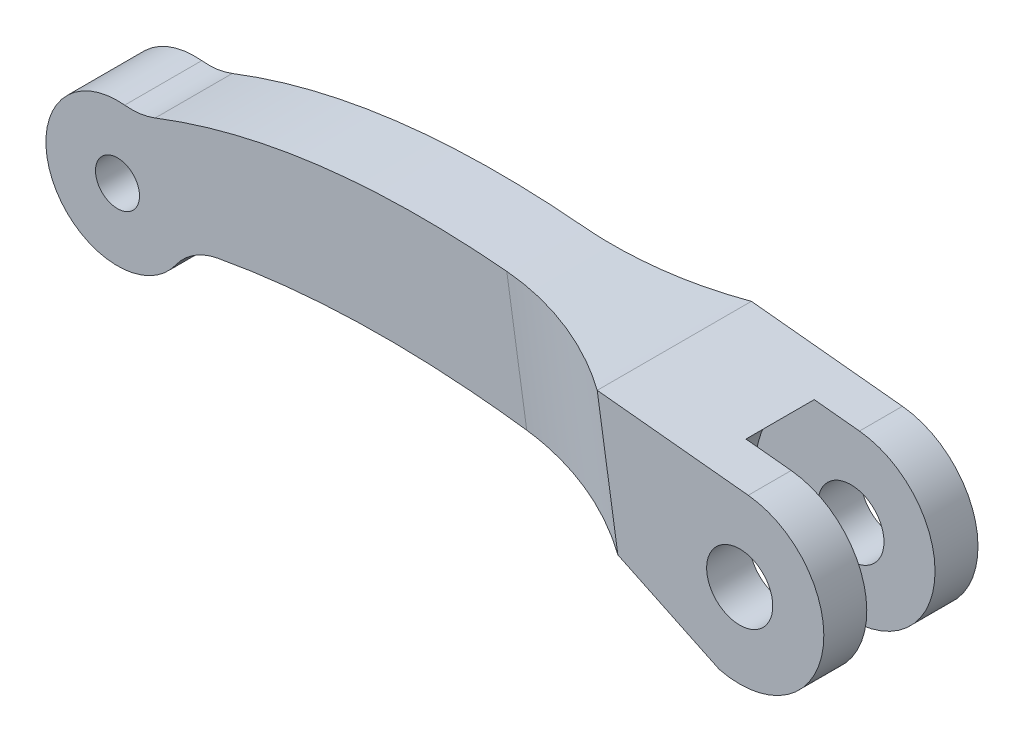
ISO-10303-21;
HEADER;
FILE_DESCRIPTION(('STEP AP214'),'2;1');
FILE_NAME('part.step','',(''),(''),'','','');
FILE_SCHEMA(('AUTOMOTIVE_DESIGN { 1 0 10303 214 1 1 1 1 }'));
ENDSEC;
DATA;
#1=APPLICATION_CONTEXT('core data for automotive mechanical design processes');
#2=APPLICATION_PROTOCOL_DEFINITION('international standard','automotive_design',2000,#1);
#3=PRODUCT_CONTEXT('',#1,'mechanical');
#4=PRODUCT('Part','Part','',(#3));
#5=PRODUCT_RELATED_PRODUCT_CATEGORY('part','',(#4));
#6=PRODUCT_DEFINITION_FORMATION('','',#4);
#7=PRODUCT_DEFINITION_CONTEXT('part definition',#1,'design');
#8=PRODUCT_DEFINITION('design','',#6,#7);
#9=PRODUCT_DEFINITION_SHAPE('','',#8);
#10=(LENGTH_UNIT() NAMED_UNIT(*) SI_UNIT(.MILLI.,.METRE.));
#11=(NAMED_UNIT(*) PLANE_ANGLE_UNIT() SI_UNIT($,.RADIAN.));
#12=(NAMED_UNIT(*) SI_UNIT($,.STERADIAN.) SOLID_ANGLE_UNIT());
#13=UNCERTAINTY_MEASURE_WITH_UNIT(LENGTH_MEASURE(1.E-05),#10,'distance_accuracy_value','');
#14=(GEOMETRIC_REPRESENTATION_CONTEXT(3) GLOBAL_UNCERTAINTY_ASSIGNED_CONTEXT((#13)) GLOBAL_UNIT_ASSIGNED_CONTEXT((#10,
#11,#12)) REPRESENTATION_CONTEXT('',''));
#15=CARTESIAN_POINT('',(0.,0.,0.));
#16=DIRECTION('',(0.,0.,1.));
#17=DIRECTION('',(1.,0.,0.));
#18=AXIS2_PLACEMENT_3D('',#15,#16,#17);
#19=CARTESIAN_POINT('',(30.,0.,3.5));
#20=DIRECTION('',(0.,0.,-1.));
#21=DIRECTION('',(-1.,0.,0.));
#22=AXIS2_PLACEMENT_3D('',#19,#20,#21);
#23=CYLINDRICAL_SURFACE('',#22,3.81951482389573);
#24=CARTESIAN_POINT('',(30.,0.,-1.55));
#25=DIRECTION('',(0.,0.,1.));
#26=DIRECTION('',(1.,0.,0.));
#27=AXIS2_PLACEMENT_3D('',#24,#25,#26);
#28=CIRCLE('',#27,3.81951482389573);
#29=CARTESIAN_POINT('',(29.0736504453051,-3.7054783756589,-1.55));
#30=VERTEX_POINT('',#29);
#31=CARTESIAN_POINT('',(30.3873591535676,3.79982188741875,-1.55));
#32=VERTEX_POINT('',#31);
#33=EDGE_CURVE('E181',#30,#32,#28,.T.);
#34=ORIENTED_EDGE('',*,*,#33,.F.);
#35=DIRECTION('',(0.,0.,-1.));
#36=VECTOR('',#35,1.);
#37=CARTESIAN_POINT('',(29.0736504453051,-3.7054783756589,3.5));
#38=LINE('',#37,#36);
#39=CARTESIAN_POINT('',(29.0736504453051,-3.7054783756589,-3.5));
#40=VERTEX_POINT('',#39);
#41=EDGE_CURVE('E202',#30,#40,#38,.T.);
#42=ORIENTED_EDGE('',*,*,#41,.T.);
#43=CARTESIAN_POINT('',(30.,0.,-3.5));
#44=DIRECTION('',(0.,0.,1.));
#45=DIRECTION('',(1.,0.,0.));
#46=AXIS2_PLACEMENT_3D('',#43,#44,#45);
#47=CIRCLE('',#46,3.81951482389573);
#48=CARTESIAN_POINT('',(30.3873591535676,3.79982188741875,-3.5));
#49=VERTEX_POINT('',#48);
#50=EDGE_CURVE('E187',#40,#49,#47,.T.);
#51=ORIENTED_EDGE('',*,*,#50,.T.);
#52=DIRECTION('',(0.,0.,-1.));
#53=VECTOR('',#52,1.);
#54=CARTESIAN_POINT('',(30.3873591535676,3.79982188741875,3.5));
#55=LINE('',#54,#53);
#56=EDGE_CURVE('E218',#32,#49,#55,.T.);
#57=ORIENTED_EDGE('',*,*,#56,.F.);
#58=EDGE_LOOP('',(#34,#42,#51,#57));
#59=FACE_BOUND('',#58,.T.);
#60=ADVANCED_FACE('F46',(#59),#23,.T.);
#61=CARTESIAN_POINT('',(30.3873591535676,3.79982188741875,3.5));
#62=DIRECTION('',(-0.101415800551142,-0.994844126181871,0.));
#63=DIRECTION('',(0.994844126181871,-0.101415800551142,0.));
#64=AXIS2_PLACEMENT_3D('',#61,#62,#63);
#65=PLANE('',#64);
#66=DIRECTION('',(-0.994844126181871,0.101415800551142,0.));
#67=VECTOR('',#66,1.);
#68=CARTESIAN_POINT('',(30.3873591535676,3.79982188741875,-1.55));
#69=LINE('',#68,#67);
#70=CARTESIAN_POINT('',(28.332958807962,4.00925032974344,-1.55));
#71=VERTEX_POINT('',#70);
#72=EDGE_CURVE('E158',#32,#71,#69,.T.);
#73=ORIENTED_EDGE('',*,*,#72,.F.);
#74=ORIENTED_EDGE('',*,*,#56,.T.);
#75=DIRECTION('',(-0.994844126181871,0.101415800551142,0.));
#76=VECTOR('',#75,1.);
#77=CARTESIAN_POINT('',(30.3873591535676,3.79982188741875,-3.5));
#78=LINE('',#77,#76);
#79=CARTESIAN_POINT('',(23.5309276765666,4.49877609419062,-3.5));
#80=VERTEX_POINT('',#79);
#81=EDGE_CURVE('E205',#49,#80,#78,.T.);
#82=ORIENTED_EDGE('',*,*,#81,.T.);
#83=DIRECTION('',(0.,0.,-1.));
#84=VECTOR('',#83,1.);
#85=CARTESIAN_POINT('',(23.5309276765666,4.49877609419062,1.75));
#86=LINE('',#85,#84);
#87=CARTESIAN_POINT('',(23.5309276765527,4.49877609427949,3.5));
#88=VERTEX_POINT('',#87);
#89=EDGE_CURVE('E355',#80,#88,#86,.F.);
#90=ORIENTED_EDGE('',*,*,#89,.T.);
#91=DIRECTION('',(-0.994844126181871,0.101415800551142,0.));
#92=VECTOR('',#91,1.);
#93=CARTESIAN_POINT('',(30.3873591535676,3.79982188741875,3.5));
#94=LINE('',#93,#92);
#95=CARTESIAN_POINT('',(30.3873591535676,3.79982188741875,3.5));
#96=VERTEX_POINT('',#95);
#97=EDGE_CURVE('E193',#96,#88,#94,.T.);
#98=ORIENTED_EDGE('',*,*,#97,.F.);
#99=CARTESIAN_POINT('',(30.3873591535676,3.79982188741875,1.55));
#100=VERTEX_POINT('',#99);
#101=EDGE_CURVE('E170',#96,#100,#55,.T.);
#102=ORIENTED_EDGE('',*,*,#101,.T.);
#103=DIRECTION('',(-0.994844126181871,0.101415800551142,0.));
#104=VECTOR('',#103,1.);
#105=CARTESIAN_POINT('',(30.3873591535676,3.79982188741875,1.55));
#106=LINE('',#105,#104);
#107=CARTESIAN_POINT('',(28.332958807962,4.00925032974344,1.55));
#108=VERTEX_POINT('',#107);
#109=EDGE_CURVE('E162',#100,#108,#106,.T.);
#110=ORIENTED_EDGE('',*,*,#109,.T.);
#111=DIRECTION('',(0.,0.,1.));
#112=VECTOR('',#111,1.);
#113=CARTESIAN_POINT('',(28.332958807962,4.00925032974344,-1.55));
#114=LINE('',#113,#112);
#115=EDGE_CURVE('E147',#108,#71,#114,.F.);
#116=ORIENTED_EDGE('',*,*,#115,.T.);
#117=EDGE_LOOP('',(#73,#74,#82,#90,#98,#102,#110,#116));
#118=FACE_BOUND('',#117,.T.);
#119=ADVANCED_FACE('F168',(#118),#65,.F.);
#120=CARTESIAN_POINT('',(24.4680384486734,-1.50366690841318,3.5));
#121=DIRECTION('',(0.431316388346312,0.902200738829166,0.));
#122=DIRECTION('',(-0.902200738829166,0.431316388346312,0.));
#123=AXIS2_PLACEMENT_3D('',#120,#121,#122);
#124=PLANE('',#123);
#125=DIRECTION('',(0.902200738829166,-0.431316388346312,0.));
#126=VECTOR('',#125,1.);
#127=CARTESIAN_POINT('',(24.4680384486734,-1.50366690841318,-1.55));
#128=LINE('',#127,#126);
#129=CARTESIAN_POINT('',(26.3997101858718,-2.42714395880917,-1.55));
#130=VERTEX_POINT('',#129);
#131=EDGE_CURVE('E175',#130,#30,#128,.T.);
#132=ORIENTED_EDGE('',*,*,#131,.F.);
#133=DIRECTION('',(0.,0.,1.));
#134=VECTOR('',#133,1.);
#135=CARTESIAN_POINT('',(26.3997101858718,-2.42714395880917,-1.55));
#136=LINE('',#135,#134);
#137=CARTESIAN_POINT('',(26.3997101858718,-2.42714395880917,1.55));
#138=VERTEX_POINT('',#137);
#139=EDGE_CURVE('E321',#130,#138,#136,.T.);
#140=ORIENTED_EDGE('',*,*,#139,.T.);
#141=DIRECTION('',(0.902200738829166,-0.431316388346312,0.));
#142=VECTOR('',#141,1.);
#143=CARTESIAN_POINT('',(24.4680384486734,-1.50366690841318,1.55));
#144=LINE('',#143,#142);
#145=CARTESIAN_POINT('',(29.0736504453051,-3.7054783756589,1.55));
#146=VERTEX_POINT('',#145);
#147=EDGE_CURVE('E165',#138,#146,#144,.T.);
#148=ORIENTED_EDGE('',*,*,#147,.T.);
#149=CARTESIAN_POINT('',(29.0736504453051,-3.7054783756589,3.5));
#150=VERTEX_POINT('',#149);
#151=EDGE_CURVE('E213',#150,#146,#38,.T.);
#152=ORIENTED_EDGE('',*,*,#151,.F.);
#153=DIRECTION('',(0.902200738829166,-0.431316388346312,0.));
#154=VECTOR('',#153,1.);
#155=CARTESIAN_POINT('',(24.4680384486734,-1.50366690841318,3.5));
#156=LINE('',#155,#154);
#157=CARTESIAN_POINT('',(24.4680384486734,-1.50366690841318,3.5));
#158=VERTEX_POINT('',#157);
#159=EDGE_CURVE('E200',#158,#150,#156,.T.);
#160=ORIENTED_EDGE('',*,*,#159,.F.);
#161=DIRECTION('',(0.,0.,-1.));
#162=VECTOR('',#161,1.);
#163=CARTESIAN_POINT('',(24.4680384486734,-1.50366690841318,3.5));
#164=LINE('',#163,#162);
#165=CARTESIAN_POINT('',(24.4680384486734,-1.50366690841318,-3.5));
#166=VERTEX_POINT('',#165);
#167=EDGE_CURVE('E216',#158,#166,#164,.T.);
#168=ORIENTED_EDGE('',*,*,#167,.T.);
#169=DIRECTION('',(0.902200738829166,-0.431316388346312,0.));
#170=VECTOR('',#169,1.);
#171=CARTESIAN_POINT('',(24.4680384486734,-1.50366690841318,-3.5));
#172=LINE('',#171,#170);
#173=EDGE_CURVE('E194',#166,#40,#172,.T.);
#174=ORIENTED_EDGE('',*,*,#173,.T.);
#175=ORIENTED_EDGE('',*,*,#41,.F.);
#176=EDGE_LOOP('',(#132,#140,#148,#152,#160,#168,#174,#175));
#177=FACE_BOUND('',#176,.T.);
#178=ADVANCED_FACE('F298',(#177),#124,.F.);
#179=CARTESIAN_POINT('',(30.,0.,1.75));
#180=DIRECTION('',(0.,0.,-1.));
#181=DIRECTION('',(-1.,0.,0.));
#182=AXIS2_PLACEMENT_3D('',#179,#180,#181);
#183=CYLINDRICAL_SURFACE('',#182,1.5);
#184=CARTESIAN_POINT('',(30.,0.,-3.5));
#185=DIRECTION('',(0.,0.,1.));
#186=DIRECTION('',(1.,0.,0.));
#187=AXIS2_PLACEMENT_3D('',#184,#185,#186);
#188=CIRCLE('',#187,1.5);
#189=CARTESIAN_POINT('',(31.5,0.,-3.5));
#190=VERTEX_POINT('',#189);
#191=EDGE_CURVE('E157',#190,#190,#188,.T.);
#192=ORIENTED_EDGE('',*,*,#191,.F.);
#193=EDGE_LOOP('',(#192));
#194=FACE_BOUND('',#193,.T.);
#195=CARTESIAN_POINT('',(30.,0.,-1.55));
#196=DIRECTION('',(0.,0.,1.));
#197=DIRECTION('',(1.,0.,0.));
#198=AXIS2_PLACEMENT_3D('',#195,#196,#197);
#199=CIRCLE('',#198,1.5);
#200=CARTESIAN_POINT('',(31.5,0.,-1.55));
#201=VERTEX_POINT('',#200);
#202=EDGE_CURVE('E171',#201,#201,#199,.T.);
#203=ORIENTED_EDGE('',*,*,#202,.T.);
#204=EDGE_LOOP('',(#203));
#205=FACE_BOUND('',#204,.T.);
#206=ADVANCED_FACE('F311',(#194,#205),#183,.F.);
#207=CARTESIAN_POINT('',(15.1434566288946,-0.0860465630170061,1.75));
#208=DIRECTION('',(0.,0.,1.));
#209=DIRECTION('',(1.,0.,0.));
#210=AXIS2_PLACEMENT_3D('',#207,#208,#209);
#211=PLANE('',#210);
#212=CARTESIAN_POINT('',(0.,0.,1.75));
#213=DIRECTION('',(0.,0.,1.));
#214=DIRECTION('',(1.,0.,0.));
#215=AXIS2_PLACEMENT_3D('',#212,#213,#214);
#216=CIRCLE('',#215,0.999999999999999);
#217=CARTESIAN_POINT('',(0.999999999999999,0.,1.75));
#218=VERTEX_POINT('',#217);
#219=EDGE_CURVE('E221',#218,#218,#216,.T.);
#220=ORIENTED_EDGE('',*,*,#219,.F.);
#221=EDGE_LOOP('',(#220));
#222=FACE_BOUND('',#221,.T.);
#223=CARTESIAN_POINT('',(0.,0.,1.75));
#224=DIRECTION('',(0.,0.,1.));
#225=DIRECTION('',(1.,0.,0.));
#226=AXIS2_PLACEMENT_3D('',#223,#224,#225);
#227=CIRCLE('',#226,3.25156797592651);
#228=CARTESIAN_POINT('',(0.326131913208965,3.23517113569861,1.75));
#229=VERTEX_POINT('',#228);
#230=CARTESIAN_POINT('',(2.64989931473271,-1.88433752917303,1.75));
#231=VERTEX_POINT('',#230);
#232=EDGE_CURVE('E358',#229,#231,#227,.T.);
#233=ORIENTED_EDGE('',*,*,#232,.T.);
#234=CARTESIAN_POINT('',(5.09478067752598,-3.62288724714664,1.75));
#235=DIRECTION('',(0.,0.,1.));
#236=DIRECTION('',(1.,0.,0.));
#237=AXIS2_PLACEMENT_3D('',#234,#235,#236);
#238=CIRCLE('',#237,3.);
#239=CARTESIAN_POINT('',(4.54837920771633,-0.673065992597505,1.75));
#240=VERTEX_POINT('',#239);
#241=EDGE_CURVE('E13',#231,#240,#238,.F.);
#242=ORIENTED_EDGE('',*,*,#241,.T.);
#243=CARTESIAN_POINT('',(3.10378888476465,-0.969117568142393,1.75));
#244=CARTESIAN_POINT('',(14.5104815776484,1.59646624385346,1.75));
#245=CARTESIAN_POINT('',(28.4490744755167,-2.56800117163254,1.75));
#246=B_SPLINE_CURVE_WITH_KNOTS('',2,(#243,#244,#245),.UNSPECIFIED.,.F.,.F.,(3,3),(0.,1.),.UNSPECIFIED.);
#247=CARTESIAN_POINT('',(18.5791240102049,-0.420349304380086,1.75));
#248=VERTEX_POINT('',#247);
#249=EDGE_CURVE('E227',#240,#248,#246,.T.);
#250=ORIENTED_EDGE('',*,*,#249,.T.);
#251=DIRECTION('',(-0.154253001765196,0.988031381812555,0.));
#252=VECTOR('',#251,1.);
#253=CARTESIAN_POINT('',(17.9472389772635,3.62704189773231,1.75));
#254=LINE('',#253,#252);
#255=CARTESIAN_POINT('',(17.6743606185291,5.37490015225305,1.75));
#256=VERTEX_POINT('',#255);
#257=EDGE_CURVE('E346',#248,#256,#254,.T.);
#258=ORIENTED_EDGE('',*,*,#257,.T.);
#259=CARTESIAN_POINT('',(29.5303772913072,2.96301442984674,1.75));
#260=CARTESIAN_POINT('',(12.7162438185557,8.072477664399,1.75));
#261=CARTESIAN_POINT('',(0.942854613223681,3.11186752295043,1.75));
#262=B_SPLINE_CURVE_WITH_KNOTS('',2,(#259,#260,#261),.UNSPECIFIED.,.F.,.F.,(3,3),(0.,1.),.UNSPECIFIED.);
#263=CARTESIAN_POINT('',(1.71263861783045,3.42335603326119,1.75));
#264=VERTEX_POINT('',#263);
#265=EDGE_CURVE('E232',#256,#264,#262,.T.);
#266=ORIENTED_EDGE('',*,*,#265,.T.);
#267=CARTESIAN_POINT('',(0.62703158588092,6.22004288955772,1.75));
#268=DIRECTION('',(0.,0.,1.));
#269=DIRECTION('',(1.,0.,0.));
#270=AXIS2_PLACEMENT_3D('',#267,#268,#269);
#271=CIRCLE('',#270,3.);
#272=EDGE_CURVE('E377',#264,#229,#271,.F.);
#273=ORIENTED_EDGE('',*,*,#272,.T.);
#274=EDGE_LOOP('',(#233,#242,#250,#258,#266,#273));
#275=FACE_BOUND('',#274,.T.);
#276=ADVANCED_FACE('F376',(#222,#275),#211,.T.);
#277=CARTESIAN_POINT('',(15.1434566288946,-0.0860465630170061,-1.75));
#278=DIRECTION('',(0.,0.,1.));
#279=DIRECTION('',(1.,0.,0.));
#280=AXIS2_PLACEMENT_3D('',#277,#278,#279);
#281=PLANE('',#280);
#282=CARTESIAN_POINT('',(0.,0.,-1.75));
#283=DIRECTION('',(0.,0.,1.));
#284=DIRECTION('',(1.,0.,0.));
#285=AXIS2_PLACEMENT_3D('',#282,#283,#284);
#286=CIRCLE('',#285,0.999999999999999);
#287=CARTESIAN_POINT('',(0.999999999999999,0.,-1.75));
#288=VERTEX_POINT('',#287);
#289=EDGE_CURVE('E220',#288,#288,#286,.T.);
#290=ORIENTED_EDGE('',*,*,#289,.T.);
#291=EDGE_LOOP('',(#290));
#292=FACE_BOUND('',#291,.T.);
#293=CARTESIAN_POINT('',(29.5303772913072,2.96301442984674,-1.75));
#294=CARTESIAN_POINT('',(12.7162438185557,8.072477664399,-1.75));
#295=CARTESIAN_POINT('',(0.942854613223681,3.11186752295043,-1.75));
#296=B_SPLINE_CURVE_WITH_KNOTS('',2,(#293,#294,#295),.UNSPECIFIED.,.F.,.F.,(3,3),(0.,1.),.UNSPECIFIED.);
#297=CARTESIAN_POINT('',(17.6743606185291,5.37490015225304,-1.75));
#298=VERTEX_POINT('',#297);
#299=CARTESIAN_POINT('',(1.71263861783045,3.42335603326119,-1.75));
#300=VERTEX_POINT('',#299);
#301=EDGE_CURVE('E361',#298,#300,#296,.T.);
#302=ORIENTED_EDGE('',*,*,#301,.F.);
#303=DIRECTION('',(0.154253001765196,-0.988031381812555,0.));
#304=VECTOR('',#303,1.);
#305=CARTESIAN_POINT('',(18.4464257666506,0.429618135104225,-1.75));
#306=LINE('',#305,#304);
#307=CARTESIAN_POINT('',(18.5791240102049,-0.420349304380086,-1.75));
#308=VERTEX_POINT('',#307);
#309=EDGE_CURVE('E342',#298,#308,#306,.T.);
#310=ORIENTED_EDGE('',*,*,#309,.T.);
#311=CARTESIAN_POINT('',(3.10378888476465,-0.969117568142393,-1.75));
#312=CARTESIAN_POINT('',(14.5104815776484,1.59646624385346,-1.75));
#313=CARTESIAN_POINT('',(28.4490744755167,-2.56800117163254,-1.75));
#314=B_SPLINE_CURVE_WITH_KNOTS('',2,(#311,#312,#313),.UNSPECIFIED.,.F.,.F.,(3,3),(0.,1.),.UNSPECIFIED.);
#315=CARTESIAN_POINT('',(4.54837920771633,-0.673065992597505,-1.75));
#316=VERTEX_POINT('',#315);
#317=EDGE_CURVE('E224',#316,#308,#314,.T.);
#318=ORIENTED_EDGE('',*,*,#317,.F.);
#319=CARTESIAN_POINT('',(5.09478067752598,-3.62288724714664,-1.75));
#320=DIRECTION('',(0.,0.,1.));
#321=DIRECTION('',(1.,0.,0.));
#322=AXIS2_PLACEMENT_3D('',#319,#320,#321);
#323=CIRCLE('',#322,3.);
#324=CARTESIAN_POINT('',(2.64989931473271,-1.88433752917303,-1.75));
#325=VERTEX_POINT('',#324);
#326=EDGE_CURVE('E54',#316,#325,#323,.T.);
#327=ORIENTED_EDGE('',*,*,#326,.T.);
#328=CARTESIAN_POINT('',(0.,0.,-1.75));
#329=DIRECTION('',(0.,0.,1.));
#330=DIRECTION('',(1.,0.,0.));
#331=AXIS2_PLACEMENT_3D('',#328,#329,#330);
#332=CIRCLE('',#331,3.25156797592651);
#333=CARTESIAN_POINT('',(0.326131913208965,3.23517113569861,-1.75));
#334=VERTEX_POINT('',#333);
#335=EDGE_CURVE('E233',#334,#325,#332,.T.);
#336=ORIENTED_EDGE('',*,*,#335,.F.);
#337=CARTESIAN_POINT('',(0.62703158588092,6.22004288955772,-1.75));
#338=DIRECTION('',(0.,0.,1.));
#339=DIRECTION('',(1.,0.,0.));
#340=AXIS2_PLACEMENT_3D('',#337,#338,#339);
#341=CIRCLE('',#340,3.);
#342=EDGE_CURVE('E385',#334,#300,#341,.T.);
#343=ORIENTED_EDGE('',*,*,#342,.T.);
#344=EDGE_LOOP('',(#302,#310,#318,#327,#336,#343));
#345=FACE_BOUND('',#344,.T.);
#346=ADVANCED_FACE('F248',(#292,#345),#281,.F.);
#347=DIRECTION('',(0.,0.,-1.));
#348=VECTOR('',#347,1.);
#349=SURFACE_OF_LINEAR_EXTRUSION('',#246,#348);
#350=ORIENTED_EDGE('',*,*,#249,.F.);
#351=DIRECTION('',(0.,0.,-1.));
#352=VECTOR('',#351,1.);
#353=CARTESIAN_POINT('',(4.54837920771632,-0.673065992597507,1.75));
#354=LINE('',#353,#352);
#355=EDGE_CURVE('E387',#240,#316,#354,.T.);
#356=ORIENTED_EDGE('',*,*,#355,.T.);
#357=ORIENTED_EDGE('',*,*,#317,.T.);
#358=CARTESIAN_POINT('',(18.5791240102049,-0.420349304379723,-1.75));
#359=CARTESIAN_POINT('',(18.7860140453835,-0.447370595897928,-1.74999530920506));
#360=CARTESIAN_POINT('',(18.9927379085319,-0.475593994673789,-1.75601447878378));
#361=CARTESIAN_POINT('',(19.4051563336976,-0.534270048917931,-1.77994078720679));
#362=CARTESIAN_POINT('',(19.610851008855,-0.564722453328576,-1.79784658906202));
#363=CARTESIAN_POINT('',(20.0205614731591,-0.627687798182205,-1.84538654306364));
#364=CARTESIAN_POINT('',(20.2245772579139,-0.660200744013517,-1.87502072588088));
#365=CARTESIAN_POINT('',(20.6255723778886,-0.726307727488005,-1.94500637910223));
#366=CARTESIAN_POINT('',(20.8226051074626,-0.75985913951839,-1.98509305031042));
#367=CARTESIAN_POINT('',(21.2138725581274,-0.828529724936224,-2.07609060566597));
#368=CARTESIAN_POINT('',(21.4081074666767,-0.863648792635825,-2.1270007609863));
#369=CARTESIAN_POINT('',(21.7931544552154,-0.935217907124064,-2.23941655972284));
#370=CARTESIAN_POINT('',(21.9839672178874,-0.971667683945057,-2.30092006332329));
#371=CARTESIAN_POINT('',(22.573170325231,-1.08711660566086,-2.50905044827282));
#372=CARTESIAN_POINT('',(22.9649715204033,-1.16809814444615,-2.67393241950613));
#373=CARTESIAN_POINT('',(23.5387118233923,-1.29211655645065,-2.95620482581614));
#374=CARTESIAN_POINT('',(23.7291813618012,-1.33424783017205,-3.05712704520281));
#375=CARTESIAN_POINT('',(24.103610344856,-1.41881081314197,-3.27020103375741));
#376=CARTESIAN_POINT('',(24.2875710840257,-1.46124246061201,-3.38235055276158));
#377=CARTESIAN_POINT('',(24.4680384486823,-1.50366690834397,-3.50000000001331));
#378=B_SPLINE_CURVE_WITH_KNOTS('',3,(#358,#359,#360,#361,#362,#363,#364,#365,#366,#367,#368,
#369,#370,#371,#372,#373,#374,#375,#376,#377),.UNSPECIFIED.,.F.,.F.,(4,2,2,2,2,2,2,2,2,4),(0.,
0.625837677195284,1.25160497311129,1.87737390548016,2.4886142444593,3.09981343703296,
3.71088931419059,5.0055924490434,5.66418184373582,6.32263950787212),.UNSPECIFIED.);
#379=EDGE_CURVE('E257',#308,#166,#378,.T.);
#380=ORIENTED_EDGE('',*,*,#379,.T.);
#381=ORIENTED_EDGE('',*,*,#167,.F.);
#382=CARTESIAN_POINT('',(24.4680384486734,-1.50366690841318,3.5));
#383=CARTESIAN_POINT('',(24.2087907484848,-1.44271183129056,3.33096907374079));
#384=CARTESIAN_POINT('',(23.9421942911938,-1.38172878816104,3.17325175496518));
#385=CARTESIAN_POINT('',(23.3961693014222,-1.2606979676759,2.88126971936627));
#386=CARTESIAN_POINT('',(23.1167379123716,-1.20065040254368,2.74701025562743));
#387=CARTESIAN_POINT('',(22.5537447198748,-1.08390311585086,2.50572509491843));
#388=CARTESIAN_POINT('',(22.2704357794165,-1.02715783660932,2.39813175619154));
#389=CARTESIAN_POINT('',(21.6954547493137,-0.916411107125712,2.20694047877803));
#390=CARTESIAN_POINT('',(21.4037851260966,-0.862408860450218,2.12333554195791));
#391=CARTESIAN_POINT('',(20.6997525697086,-0.737712724116284,1.95323357867711));
#392=CARTESIAN_POINT('',(20.2842682547758,-0.668624043510336,1.87808209796108));
#393=CARTESIAN_POINT('',(19.6523659448639,-0.570928876644029,1.80177380294828));
#394=CARTESIAN_POINT('',(19.4384725106214,-0.539114798854045,1.78240312462466));
#395=CARTESIAN_POINT('',(19.0095069111954,-0.477886357584167,1.75651619776064));
#396=CARTESIAN_POINT('',(18.7944344314403,-0.448472671478514,1.75000356573118));
#397=CARTESIAN_POINT('',(18.5791240102049,-0.420349304380084,1.75));
#398=B_SPLINE_CURVE_WITH_KNOTS('',3,(#382,#383,#384,#385,#386,#387,#388,#389,#390,#391,#392,
#393,#394,#395,#396,#397),.UNSPECIFIED.,.F.,.F.,(4,2,2,2,2,2,2,4),(0.,0.94597937533463,
1.8921703198056,2.81604464947242,3.73964918272226,5.01984132922365,5.67084241890695,
6.32202658596446),.UNSPECIFIED.);
#399=EDGE_CURVE('E265',#158,#248,#398,.T.);
#400=ORIENTED_EDGE('',*,*,#399,.T.);
#401=EDGE_LOOP('',(#350,#356,#357,#380,#381,#400));
#402=FACE_BOUND('',#401,.T.);
#403=ADVANCED_FACE('F242',(#402),#349,.F.);
#404=DIRECTION('',(0.,0.,-1.));
#405=VECTOR('',#404,1.);
#406=SURFACE_OF_LINEAR_EXTRUSION('',#262,#405);
#407=ORIENTED_EDGE('',*,*,#301,.T.);
#408=DIRECTION('',(0.,0.,-1.));
#409=VECTOR('',#408,1.);
#410=CARTESIAN_POINT('',(1.71263861783045,3.42335603326119,-1.75));
#411=LINE('',#410,#409);
#412=EDGE_CURVE('E382',#300,#264,#411,.F.);
#413=ORIENTED_EDGE('',*,*,#412,.T.);
#414=ORIENTED_EDGE('',*,*,#265,.F.);
#415=CARTESIAN_POINT('',(17.6743606183166,5.37490014990071,1.75));
#416=CARTESIAN_POINT('',(17.8774924874047,5.35655896263313,1.74999481176071));
#417=CARTESIAN_POINT('',(18.0804945853478,5.33688395836435,1.75587268286286));
#418=CARTESIAN_POINT('',(18.4855384607256,5.29503597788547,1.77923762788022));
#419=CARTESIAN_POINT('',(18.6875803909922,5.27286341411211,1.79672278734219));
#420=CARTESIAN_POINT('',(19.0900671735783,5.22618421375906,1.8431451007266));
#421=CARTESIAN_POINT('',(19.2905120529013,5.2016776167352,1.87208206059688));
#422=CARTESIAN_POINT('',(19.6844923712389,5.15112980122402,1.94040812176596));
#423=CARTESIAN_POINT('',(19.8780795956272,5.12513806292835,1.97953613269718));
#424=CARTESIAN_POINT('',(20.2625574955273,5.07132100053063,2.06834679747995));
#425=CARTESIAN_POINT('',(20.453448309191,5.04349577078519,2.11802890848004));
#426=CARTESIAN_POINT('',(20.831918300778,4.9862445988178,2.22771585916324));
#427=CARTESIAN_POINT('',(21.0194980813148,4.95681895193739,2.28771879862701));
#428=CARTESIAN_POINT('',(21.6111994449127,4.86085264847172,2.49508084777362));
#429=CARTESIAN_POINT('',(22.0084212849811,4.79166489326487,2.66167592030205));
#430=CARTESIAN_POINT('',(22.5898032367781,4.6843475520423,2.94764474697273));
#431=CARTESIAN_POINT('',(22.7828248733416,4.64764599629588,3.05004839848885));
#432=CARTESIAN_POINT('',(23.1620848263203,4.5736041952871,3.26641956778257));
#433=CARTESIAN_POINT('',(23.3483247377753,4.53626410328256,3.38038434223539));
#434=CARTESIAN_POINT('',(23.5309276765666,4.49877609419062,3.5));
#435=B_SPLINE_CURVE_WITH_KNOTS('',3,(#415,#416,#417,#418,#419,#420,#421,#422,#423,#424,#425,
#426,#427,#428,#429,#430,#431,#432,#433,#434),.UNSPECIFIED.,.F.,.F.,(4,2,2,2,2,2,2,2,2,4),(0.,
0.611771774376838,1.22344267096696,1.83510320316278,2.43241640383845,3.02969888907043,
3.62687152311871,4.93194914505523,5.59631369583589,6.26052096748151),.UNSPECIFIED.);
#436=EDGE_CURVE('E273',#256,#88,#435,.T.);
#437=ORIENTED_EDGE('',*,*,#436,.T.);
#438=ORIENTED_EDGE('',*,*,#89,.F.);
#439=CARTESIAN_POINT('',(23.5309276765666,4.49877609419062,-3.5));
#440=CARTESIAN_POINT('',(23.2762492088152,4.55107079794053,-3.33314487661136));
#441=CARTESIAN_POINT('',(23.0143499985677,4.60308975224954,-3.17724504800839));
#442=CARTESIAN_POINT('',(22.4779023217435,4.7055956451046,-2.88821115012338));
#443=CARTESIAN_POINT('',(22.2033506905029,4.75608219506563,-2.75508281618441));
#444=CARTESIAN_POINT('',(21.6502148600744,4.85333838739625,-2.51543234248308));
#445=CARTESIAN_POINT('',(21.3718841427666,4.90016804645504,-2.40835003235494));
#446=CARTESIAN_POINT('',(20.8069402736641,4.99053153499357,-2.21757528222022));
#447=CARTESIAN_POINT('',(20.5203295415776,5.03406631415555,-2.13387608364334));
#448=CARTESIAN_POINT('',(19.8175133979535,5.13466909724089,-1.96016027765403));
#449=CARTESIAN_POINT('',(19.3978450730145,5.18965702980109,-1.88248910343039));
#450=CARTESIAN_POINT('',(18.7593407131524,5.26484898757778,-1.80357578088024));
#451=CARTESIAN_POINT('',(18.5430957075436,5.28887303498112,-1.78353200742619));
#452=CARTESIAN_POINT('',(18.1094250436789,5.33407241068699,-1.75674391438439));
#453=CARTESIAN_POINT('',(17.8919990616831,5.3552469120969,-1.75000344748212));
#454=CARTESIAN_POINT('',(17.6743606186518,5.37490015224196,-1.75));
#455=B_SPLINE_CURVE_WITH_KNOTS('',3,(#439,#440,#441,#442,#443,#444,#445,#446,#447,#448,#449,
#450,#451,#452,#453,#454),.UNSPECIFIED.,.F.,.F.,(4,2,2,2,2,2,2,4),(0.,0.926490960433625,
1.85321492902886,2.75777524300262,3.66207383498635,4.94947191806315,5.60460144439039,
6.25992067076317),.UNSPECIFIED.);
#456=EDGE_CURVE('E340',#80,#298,#455,.T.);
#457=ORIENTED_EDGE('',*,*,#456,.T.);
#458=EDGE_LOOP('',(#407,#413,#414,#437,#438,#457));
#459=FACE_BOUND('',#458,.T.);
#460=ADVANCED_FACE('F247',(#459),#406,.F.);
#461=CARTESIAN_POINT('',(0.,0.,1.75));
#462=DIRECTION('',(0.,0.,-1.));
#463=DIRECTION('',(-1.,0.,0.));
#464=AXIS2_PLACEMENT_3D('',#461,#462,#463);
#465=CYLINDRICAL_SURFACE('',#464,3.25156797592651);
#466=ORIENTED_EDGE('',*,*,#232,.F.);
#467=DIRECTION('',(0.,0.,-1.));
#468=VECTOR('',#467,1.);
#469=CARTESIAN_POINT('',(0.326131913208966,3.23517113569861,1.75));
#470=LINE('',#469,#468);
#471=EDGE_CURVE('E384',#229,#334,#470,.T.);
#472=ORIENTED_EDGE('',*,*,#471,.T.);
#473=ORIENTED_EDGE('',*,*,#335,.T.);
#474=DIRECTION('',(0.,0.,-1.));
#475=VECTOR('',#474,1.);
#476=CARTESIAN_POINT('',(2.64989931473271,-1.88433752917303,1.75));
#477=LINE('',#476,#475);
#478=EDGE_CURVE('E272',#325,#231,#477,.F.);
#479=ORIENTED_EDGE('',*,*,#478,.T.);
#480=EDGE_LOOP('',(#466,#472,#473,#479));
#481=FACE_BOUND('',#480,.T.);
#482=ADVANCED_FACE('F393',(#481),#465,.T.);
#483=CARTESIAN_POINT('',(0.,0.,1.75));
#484=DIRECTION('',(0.,0.,-1.));
#485=DIRECTION('',(-1.,0.,0.));
#486=AXIS2_PLACEMENT_3D('',#483,#484,#485);
#487=CYLINDRICAL_SURFACE('',#486,0.999999999999999);
#488=ORIENTED_EDGE('',*,*,#219,.T.);
#489=EDGE_LOOP('',(#488));
#490=FACE_BOUND('',#489,.T.);
#491=ORIENTED_EDGE('',*,*,#289,.F.);
#492=EDGE_LOOP('',(#491));
#493=FACE_BOUND('',#492,.T.);
#494=ADVANCED_FACE('F400',(#490,#493),#487,.F.);
#495=CARTESIAN_POINT('',(30.,0.,3.5));
#496=DIRECTION('',(0.,0.,1.));
#497=DIRECTION('',(1.,0.,0.));
#498=AXIS2_PLACEMENT_3D('',#495,#496,#497);
#499=PLANE('',#498);
#500=CARTESIAN_POINT('',(30.,0.,3.5));
#501=DIRECTION('',(0.,0.,1.));
#502=DIRECTION('',(1.,0.,0.));
#503=AXIS2_PLACEMENT_3D('',#500,#501,#502);
#504=CIRCLE('',#503,3.81951482389573);
#505=EDGE_CURVE('E190',#150,#96,#504,.T.);
#506=ORIENTED_EDGE('',*,*,#505,.T.);
#507=ORIENTED_EDGE('',*,*,#97,.T.);
#508=DIRECTION('',(0.154253001765195,-0.988031381812555,0.));
#509=VECTOR('',#508,1.);
#510=CARTESIAN_POINT('',(23.5309276765527,4.49877609427949,3.5));
#511=LINE('',#510,#509);
#512=EDGE_CURVE('E197',#88,#158,#511,.T.);
#513=ORIENTED_EDGE('',*,*,#512,.T.);
#514=ORIENTED_EDGE('',*,*,#159,.T.);
#515=EDGE_LOOP('',(#506,#507,#513,#514));
#516=FACE_BOUND('',#515,.T.);
#517=CARTESIAN_POINT('',(30.,0.,3.5));
#518=DIRECTION('',(0.,0.,1.));
#519=DIRECTION('',(1.,0.,0.));
#520=AXIS2_PLACEMENT_3D('',#517,#518,#519);
#521=CIRCLE('',#520,1.5);
#522=CARTESIAN_POINT('',(31.5,0.,3.5));
#523=VERTEX_POINT('',#522);
#524=EDGE_CURVE('E184',#523,#523,#521,.T.);
#525=ORIENTED_EDGE('',*,*,#524,.F.);
#526=EDGE_LOOP('',(#525));
#527=FACE_BOUND('',#526,.T.);
#528=ADVANCED_FACE('F312',(#516,#527),#499,.T.);
#529=CARTESIAN_POINT('',(30.,0.,-3.5));
#530=DIRECTION('',(0.,0.,1.));
#531=DIRECTION('',(1.,0.,0.));
#532=AXIS2_PLACEMENT_3D('',#529,#530,#531);
#533=PLANE('',#532);
#534=ORIENTED_EDGE('',*,*,#50,.F.);
#535=ORIENTED_EDGE('',*,*,#173,.F.);
#536=DIRECTION('',(0.154253001765195,-0.988031381812555,0.));
#537=VECTOR('',#536,1.);
#538=CARTESIAN_POINT('',(23.5309276765527,4.49877609427949,-3.5));
#539=LINE('',#538,#537);
#540=EDGE_CURVE('E208',#80,#166,#539,.T.);
#541=ORIENTED_EDGE('',*,*,#540,.F.);
#542=ORIENTED_EDGE('',*,*,#81,.F.);
#543=EDGE_LOOP('',(#534,#535,#541,#542));
#544=FACE_BOUND('',#543,.T.);
#545=ORIENTED_EDGE('',*,*,#191,.T.);
#546=EDGE_LOOP('',(#545));
#547=FACE_BOUND('',#546,.T.);
#548=ADVANCED_FACE('F304',(#544,#547),#533,.F.);
#549=ORIENTED_EDGE('',*,*,#151,.T.);
#550=CARTESIAN_POINT('',(30.,0.,1.55));
#551=DIRECTION('',(0.,0.,1.));
#552=DIRECTION('',(1.,0.,0.));
#553=AXIS2_PLACEMENT_3D('',#550,#551,#552);
#554=CIRCLE('',#553,3.81951482389573);
#555=EDGE_CURVE('E172',#146,#100,#554,.T.);
#556=ORIENTED_EDGE('',*,*,#555,.T.);
#557=ORIENTED_EDGE('',*,*,#101,.F.);
#558=ORIENTED_EDGE('',*,*,#505,.F.);
#559=EDGE_LOOP('',(#549,#556,#557,#558));
#560=FACE_BOUND('',#559,.T.);
#561=ADVANCED_FACE('F294',(#560),#23,.T.);
#562=CARTESIAN_POINT('',(30.,0.,1.55));
#563=DIRECTION('',(0.,0.,1.));
#564=DIRECTION('',(1.,0.,0.));
#565=AXIS2_PLACEMENT_3D('',#562,#563,#564);
#566=CIRCLE('',#565,1.5);
#567=CARTESIAN_POINT('',(31.5,0.,1.55));
#568=VERTEX_POINT('',#567);
#569=EDGE_CURVE('E322',#568,#568,#566,.T.);
#570=ORIENTED_EDGE('',*,*,#569,.F.);
#571=EDGE_LOOP('',(#570));
#572=FACE_BOUND('',#571,.T.);
#573=ORIENTED_EDGE('',*,*,#524,.T.);
#574=EDGE_LOOP('',(#573));
#575=FACE_BOUND('',#574,.T.);
#576=ADVANCED_FACE('F303',(#572,#575),#183,.F.);
#577=CARTESIAN_POINT('',(30.,0.,-1.55));
#578=DIRECTION('',(0.,0.,1.));
#579=DIRECTION('',(1.,0.,0.));
#580=AXIS2_PLACEMENT_3D('',#577,#578,#579);
#581=CYLINDRICAL_SURFACE('',#580,4.34201733558255);
#582=CARTESIAN_POINT('',(30.,0.,1.55));
#583=DIRECTION('',(0.,0.,1.));
#584=DIRECTION('',(1.,0.,0.));
#585=AXIS2_PLACEMENT_3D('',#582,#583,#584);
#586=CIRCLE('',#585,4.34201733558255);
#587=EDGE_CURVE('E150',#108,#138,#586,.T.);
#588=ORIENTED_EDGE('',*,*,#587,.T.);
#589=ORIENTED_EDGE('',*,*,#139,.F.);
#590=CARTESIAN_POINT('',(30.,0.,-1.55));
#591=DIRECTION('',(0.,0.,1.));
#592=DIRECTION('',(1.,0.,0.));
#593=AXIS2_PLACEMENT_3D('',#590,#591,#592);
#594=CIRCLE('',#593,4.34201733558255);
#595=EDGE_CURVE('E153',#71,#130,#594,.T.);
#596=ORIENTED_EDGE('',*,*,#595,.F.);
#597=ORIENTED_EDGE('',*,*,#115,.F.);
#598=EDGE_LOOP('',(#588,#589,#596,#597));
#599=FACE_BOUND('',#598,.T.);
#600=ADVANCED_FACE('F149',(#599),#581,.F.);
#601=CARTESIAN_POINT('',(30.,0.,-1.55));
#602=DIRECTION('',(0.,0.,1.));
#603=DIRECTION('',(1.,0.,0.));
#604=AXIS2_PLACEMENT_3D('',#601,#602,#603);
#605=PLANE('',#604);
#606=ORIENTED_EDGE('',*,*,#202,.F.);
#607=EDGE_LOOP('',(#606));
#608=FACE_BOUND('',#607,.T.);
#609=ORIENTED_EDGE('',*,*,#72,.T.);
#610=ORIENTED_EDGE('',*,*,#595,.T.);
#611=ORIENTED_EDGE('',*,*,#131,.T.);
#612=ORIENTED_EDGE('',*,*,#33,.T.);
#613=EDGE_LOOP('',(#609,#610,#611,#612));
#614=FACE_BOUND('',#613,.T.);
#615=ADVANCED_FACE('F327',(#608,#614),#605,.T.);
#616=CARTESIAN_POINT('',(30.,0.,1.55));
#617=DIRECTION('',(0.,0.,1.));
#618=DIRECTION('',(1.,0.,0.));
#619=AXIS2_PLACEMENT_3D('',#616,#617,#618);
#620=PLANE('',#619);
#621=ORIENTED_EDGE('',*,*,#569,.T.);
#622=EDGE_LOOP('',(#621));
#623=FACE_BOUND('',#622,.T.);
#624=ORIENTED_EDGE('',*,*,#555,.F.);
#625=ORIENTED_EDGE('',*,*,#147,.F.);
#626=ORIENTED_EDGE('',*,*,#587,.F.);
#627=ORIENTED_EDGE('',*,*,#109,.F.);
#628=EDGE_LOOP('',(#624,#625,#626,#627));
#629=FACE_BOUND('',#628,.T.);
#630=ADVANCED_FACE('F161',(#623,#629),#620,.F.);
#631=CARTESIAN_POINT('',(17.9472389772635,3.62704189773231,-11.75));
#632=DIRECTION('',(0.154253001765196,-0.988031381812555,0.));
#633=DIRECTION('',(0.988031381812555,0.154253001765196,0.));
#634=AXIS2_PLACEMENT_3D('',#631,#632,#633);
#635=CYLINDRICAL_SURFACE('',#634,10.);
#636=ORIENTED_EDGE('',*,*,#379,.F.);
#637=ORIENTED_EDGE('',*,*,#309,.F.);
#638=ORIENTED_EDGE('',*,*,#456,.F.);
#639=ORIENTED_EDGE('',*,*,#540,.T.);
#640=EDGE_LOOP('',(#636,#637,#638,#639));
#641=FACE_BOUND('',#640,.T.);
#642=ADVANCED_FACE('F252',(#641),#635,.F.);
#643=CARTESIAN_POINT('',(17.9472389772635,3.62704189773231,11.75));
#644=DIRECTION('',(0.154253001765196,-0.988031381812555,0.));
#645=DIRECTION('',(0.988031381812555,0.154253001765196,0.));
#646=AXIS2_PLACEMENT_3D('',#643,#644,#645);
#647=CYLINDRICAL_SURFACE('',#646,10.);
#648=ORIENTED_EDGE('',*,*,#399,.F.);
#649=ORIENTED_EDGE('',*,*,#512,.F.);
#650=ORIENTED_EDGE('',*,*,#436,.F.);
#651=ORIENTED_EDGE('',*,*,#257,.F.);
#652=EDGE_LOOP('',(#648,#649,#650,#651));
#653=FACE_BOUND('',#652,.T.);
#654=ADVANCED_FACE('F279',(#653),#647,.F.);
#655=CARTESIAN_POINT('',(0.62703158588092,6.22004288955772,0.));
#656=DIRECTION('',(0.,0.,-1.));
#657=DIRECTION('',(-1.,0.,0.));
#658=AXIS2_PLACEMENT_3D('',#655,#656,#657);
#659=CYLINDRICAL_SURFACE('',#658,3.);
#660=ORIENTED_EDGE('',*,*,#272,.F.);
#661=ORIENTED_EDGE('',*,*,#412,.F.);
#662=ORIENTED_EDGE('',*,*,#342,.F.);
#663=ORIENTED_EDGE('',*,*,#471,.F.);
#664=EDGE_LOOP('',(#660,#661,#662,#663));
#665=FACE_BOUND('',#664,.T.);
#666=ADVANCED_FACE('F282',(#665),#659,.F.);
#667=CARTESIAN_POINT('',(5.09478067752598,-3.62288724714664,0.));
#668=DIRECTION('',(0.,0.,-1.));
#669=DIRECTION('',(-1.,0.,0.));
#670=AXIS2_PLACEMENT_3D('',#667,#668,#669);
#671=CYLINDRICAL_SURFACE('',#670,3.);
#672=ORIENTED_EDGE('',*,*,#241,.F.);
#673=ORIENTED_EDGE('',*,*,#478,.F.);
#674=ORIENTED_EDGE('',*,*,#326,.F.);
#675=ORIENTED_EDGE('',*,*,#355,.F.);
#676=EDGE_LOOP('',(#672,#673,#674,#675));
#677=FACE_BOUND('',#676,.T.);
#678=ADVANCED_FACE('F48',(#677),#671,.F.);
#679=CLOSED_SHELL('',(#60,#119,#178,#206,#276,#346,#403,#460,#482,#494,#528,#548,#561,#576,#600,
#615,#630,#642,#654,#666,#678));
#680=MANIFOLD_SOLID_BREP('B2',#679);
#681=ADVANCED_BREP_SHAPE_REPRESENTATION('',(#18,#680),#14);
#682=SHAPE_DEFINITION_REPRESENTATION(#9,#681);
ENDSEC;
END-ISO-10303-21;
